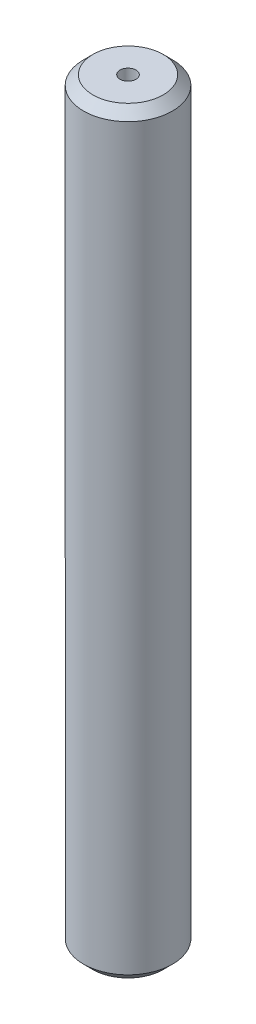
ISO-10303-21;
HEADER;
FILE_DESCRIPTION(('STEP AP214'),'2;1');
FILE_NAME('part.step','',(''),(''),'','','');
FILE_SCHEMA(('AUTOMOTIVE_DESIGN { 1 0 10303 214 1 1 1 1 }'));
ENDSEC;
DATA;
#1=APPLICATION_CONTEXT('core data for automotive mechanical design processes');
#2=APPLICATION_PROTOCOL_DEFINITION('international standard','automotive_design',2000,#1);
#3=PRODUCT_CONTEXT('',#1,'mechanical');
#4=PRODUCT('Part','Part','',(#3));
#5=PRODUCT_RELATED_PRODUCT_CATEGORY('part','',(#4));
#6=PRODUCT_DEFINITION_FORMATION('','',#4);
#7=PRODUCT_DEFINITION_CONTEXT('part definition',#1,'design');
#8=PRODUCT_DEFINITION('design','',#6,#7);
#9=PRODUCT_DEFINITION_SHAPE('','',#8);
#10=(LENGTH_UNIT() NAMED_UNIT(*) SI_UNIT(.MILLI.,.METRE.));
#11=(NAMED_UNIT(*) PLANE_ANGLE_UNIT() SI_UNIT($,.RADIAN.));
#12=(NAMED_UNIT(*) SI_UNIT($,.STERADIAN.) SOLID_ANGLE_UNIT());
#13=UNCERTAINTY_MEASURE_WITH_UNIT(LENGTH_MEASURE(1.E-05),#10,'distance_accuracy_value','');
#14=(GEOMETRIC_REPRESENTATION_CONTEXT(3) GLOBAL_UNCERTAINTY_ASSIGNED_CONTEXT((#13)) GLOBAL_UNIT_ASSIGNED_CONTEXT((#10,
#11,#12)) REPRESENTATION_CONTEXT('',''));
#15=CARTESIAN_POINT('',(0.,0.,0.));
#16=DIRECTION('',(0.,0.,1.));
#17=DIRECTION('',(1.,0.,0.));
#18=AXIS2_PLACEMENT_3D('',#15,#16,#17);
#19=CARTESIAN_POINT('',(0.,85.2303831328711,0.));
#20=DIRECTION('',(0.,-1.,0.));
#21=DIRECTION('',(0.,0.,-1.));
#22=AXIS2_PLACEMENT_3D('',#19,#20,#21);
#23=CYLINDRICAL_SURFACE('',#22,5.);
#24=CARTESIAN_POINT('',(0.,84.1824366444883,0.));
#25=DIRECTION('',(0.,1.,0.));
#26=DIRECTION('',(0.,0.,1.));
#27=AXIS2_PLACEMENT_3D('',#24,#25,#26);
#28=CIRCLE('',#27,5.);
#29=CARTESIAN_POINT('',(0.,84.1824366444883,-5.00000000000001));
#30=VERTEX_POINT('',#29);
#31=EDGE_CURVE('E50',#30,#30,#28,.F.);
#32=ORIENTED_EDGE('',*,*,#31,.T.);
#33=EDGE_LOOP('',(#32));
#34=FACE_BOUND('',#33,.T.);
#35=CARTESIAN_POINT('',(0.,1.04794648838263,0.));
#36=DIRECTION('',(0.,1.,0.));
#37=DIRECTION('',(0.,0.,1.));
#38=AXIS2_PLACEMENT_3D('',#35,#36,#37);
#39=CIRCLE('',#38,5.);
#40=CARTESIAN_POINT('',(0.,1.04794648838263,5.));
#41=VERTEX_POINT('',#40);
#42=EDGE_CURVE('E51',#41,#41,#39,.T.);
#43=ORIENTED_EDGE('',*,*,#42,.T.);
#44=EDGE_LOOP('',(#43));
#45=FACE_BOUND('',#44,.T.);
#46=ADVANCED_FACE('F39',(#34,#45),#23,.T.);
#47=CARTESIAN_POINT('',(0.,85.2303831328711,0.));
#48=DIRECTION('',(0.,1.,0.));
#49=DIRECTION('',(0.,0.,1.));
#50=AXIS2_PLACEMENT_3D('',#47,#48,#49);
#51=PLANE('',#50);
#52=CARTESIAN_POINT('',(0.,85.2303831328711,0.));
#53=DIRECTION('',(0.,1.,0.));
#54=DIRECTION('',(0.,0.,1.));
#55=AXIS2_PLACEMENT_3D('',#52,#53,#54);
#56=CIRCLE('',#55,3.95205351161732);
#57=CARTESIAN_POINT('',(0.,85.230383132871,-3.95205351161733));
#58=VERTEX_POINT('',#57);
#59=EDGE_CURVE('E54',#58,#58,#56,.T.);
#60=ORIENTED_EDGE('',*,*,#59,.T.);
#61=EDGE_LOOP('',(#60));
#62=FACE_BOUND('',#61,.T.);
#63=CARTESIAN_POINT('',(0.,85.2303831328711,0.));
#64=DIRECTION('',(0.,1.,0.));
#65=DIRECTION('',(0.,0.,1.));
#66=AXIS2_PLACEMENT_3D('',#63,#64,#65);
#67=CIRCLE('',#66,0.90016622351087);
#68=CARTESIAN_POINT('',(0.,85.2303831328711,0.90016622351087));
#69=VERTEX_POINT('',#68);
#70=EDGE_CURVE('E58',#69,#69,#67,.T.);
#71=ORIENTED_EDGE('',*,*,#70,.F.);
#72=EDGE_LOOP('',(#71));
#73=FACE_BOUND('',#72,.T.);
#74=ADVANCED_FACE('F69',(#62,#73),#51,.T.);
#75=CARTESIAN_POINT('',(0.,0.,0.));
#76=DIRECTION('',(0.,1.,0.));
#77=DIRECTION('',(0.,0.,1.));
#78=AXIS2_PLACEMENT_3D('',#75,#76,#77);
#79=PLANE('',#78);
#80=CARTESIAN_POINT('',(0.,0.,0.));
#81=DIRECTION('',(0.,1.,0.));
#82=DIRECTION('',(0.,0.,1.));
#83=AXIS2_PLACEMENT_3D('',#80,#81,#82);
#84=CIRCLE('',#83,3.95205351161735);
#85=CARTESIAN_POINT('',(0.,0.,3.95205351161735));
#86=VERTEX_POINT('',#85);
#87=EDGE_CURVE('E10',#86,#86,#84,.F.);
#88=ORIENTED_EDGE('',*,*,#87,.T.);
#89=EDGE_LOOP('',(#88));
#90=FACE_BOUND('',#89,.T.);
#91=CARTESIAN_POINT('',(0.,0.,0.));
#92=DIRECTION('',(0.,1.,0.));
#93=DIRECTION('',(0.,0.,1.));
#94=AXIS2_PLACEMENT_3D('',#91,#92,#93);
#95=CIRCLE('',#94,0.90016622351087);
#96=CARTESIAN_POINT('',(0.,0.,0.90016622351087));
#97=VERTEX_POINT('',#96);
#98=EDGE_CURVE('E63',#97,#97,#95,.T.);
#99=ORIENTED_EDGE('',*,*,#98,.T.);
#100=EDGE_LOOP('',(#99));
#101=FACE_BOUND('',#100,.T.);
#102=ADVANCED_FACE('F75',(#90,#101),#79,.F.);
#103=CARTESIAN_POINT('',(0.,85.2303831328711,0.));
#104=DIRECTION('',(0.,-1.,0.));
#105=DIRECTION('',(0.,0.,-1.));
#106=AXIS2_PLACEMENT_3D('',#103,#104,#105);
#107=CYLINDRICAL_SURFACE('',#106,0.90016622351087);
#108=ORIENTED_EDGE('',*,*,#70,.T.);
#109=EDGE_LOOP('',(#108));
#110=FACE_BOUND('',#109,.T.);
#111=ORIENTED_EDGE('',*,*,#98,.F.);
#112=EDGE_LOOP('',(#111));
#113=FACE_BOUND('',#112,.T.);
#114=ADVANCED_FACE('F70',(#110,#113),#107,.F.);
#115=CARTESIAN_POINT('',(0.,85.2303831328711,0.));
#116=DIRECTION('',(0.,-1.,0.));
#117=DIRECTION('',(0.,0.,-1.));
#118=AXIS2_PLACEMENT_3D('',#115,#116,#117);
#119=CONICAL_SURFACE('',#118,3.95205351161732,0.785398163397436);
#120=CARTESIAN_POINT('',(0.,84.1824366444883,-5.00000000000001));
#121=CARTESIAN_POINT('',(0.,84.1933527537423,-4.98908389074602));
#122=CARTESIAN_POINT('',(0.,84.2042688629963,-4.97816778149204));
#123=CARTESIAN_POINT('',(0.,84.2261010815043,-4.95633556298406));
#124=CARTESIAN_POINT('',(0.,84.2370171907583,-4.94541945373008));
#125=CARTESIAN_POINT('',(0.,84.2588494092662,-4.9235872352221));
#126=CARTESIAN_POINT('',(0.,84.2697655185202,-4.91267112596812));
#127=CARTESIAN_POINT('',(0.,84.2915977370282,-4.89083890746014));
#128=CARTESIAN_POINT('',(0.,84.3025138462822,-4.87992279820616));
#129=CARTESIAN_POINT('',(0.,84.3243460647902,-4.85809057969819));
#130=CARTESIAN_POINT('',(0.,84.3352621740442,-4.8471744704442));
#131=CARTESIAN_POINT('',(0.,84.3570943925521,-4.82534225193623));
#132=CARTESIAN_POINT('',(0.,84.3680105018061,-4.81442614268224));
#133=CARTESIAN_POINT('',(0.,84.3898427203141,-4.79259392417427));
#134=CARTESIAN_POINT('',(0.,84.4007588295681,-4.78167781492028));
#135=CARTESIAN_POINT('',(0.,84.422591048076,-4.75984559641231));
#136=CARTESIAN_POINT('',(0.,84.43350715733,-4.74892948715832));
#137=CARTESIAN_POINT('',(0.,84.455339375838,-4.72709726865035));
#138=CARTESIAN_POINT('',(0.,84.466255485092,-4.71618115939637));
#139=CARTESIAN_POINT('',(0.,84.4880877036,-4.69434894088839));
#140=CARTESIAN_POINT('',(0.,84.499003812854,-4.68343283163441));
#141=CARTESIAN_POINT('',(0.,84.5208360313619,-4.66160061312643));
#142=CARTESIAN_POINT('',(0.,84.5317521406159,-4.65068450387245));
#143=CARTESIAN_POINT('',(0.,84.5535843591239,-4.62885228536448));
#144=CARTESIAN_POINT('',(0.,84.5645004683779,-4.61793617611049));
#145=CARTESIAN_POINT('',(0.,84.5863326868858,-4.59610395760252));
#146=CARTESIAN_POINT('',(0.,84.5972487961398,-4.58518784834853));
#147=CARTESIAN_POINT('',(0.,84.6190810146478,-4.56335562984056));
#148=CARTESIAN_POINT('',(0.,84.6299971239018,-4.55243952058657));
#149=CARTESIAN_POINT('',(0.,84.6518293424098,-4.5306073020786));
#150=CARTESIAN_POINT('',(0.,84.6627454516637,-4.51969119282461));
#151=CARTESIAN_POINT('',(0.,84.6845776701717,-4.49785897431664));
#152=CARTESIAN_POINT('',(0.,84.6954937794257,-4.48694286506266));
#153=CARTESIAN_POINT('',(0.,84.7173259979337,-4.46511064655468));
#154=CARTESIAN_POINT('',(0.,84.7282421071877,-4.45419453730069));
#155=CARTESIAN_POINT('',(0.,84.7500743256956,-4.43236231879272));
#156=CARTESIAN_POINT('',(0.,84.7609904349496,-4.42144620953874));
#157=CARTESIAN_POINT('',(0.,84.7828226534576,-4.39961399103077));
#158=CARTESIAN_POINT('',(0.,84.7937387627116,-4.38869788177678));
#159=CARTESIAN_POINT('',(0.,84.8155709812196,-4.36686566326881));
#160=CARTESIAN_POINT('',(0.,84.8264870904735,-4.35594955401482));
#161=CARTESIAN_POINT('',(0.,84.8483193089815,-4.33411733550685));
#162=CARTESIAN_POINT('',(0.,84.8592354182355,-4.32320122625286));
#163=CARTESIAN_POINT('',(0.,84.8810676367435,-4.30136900774489));
#164=CARTESIAN_POINT('',(0.,84.8919837459975,-4.2904528984909));
#165=CARTESIAN_POINT('',(0.,84.9138159645054,-4.26862067998293));
#166=CARTESIAN_POINT('',(0.,84.9247320737594,-4.25770457072894));
#167=CARTESIAN_POINT('',(0.,84.9465642922674,-4.23587235222097));
#168=CARTESIAN_POINT('',(0.,84.9574804015214,-4.22495624296698));
#169=CARTESIAN_POINT('',(0.,84.9793126200294,-4.20312402445901));
#170=CARTESIAN_POINT('',(0.,84.9902287292833,-4.19220791520503));
#171=CARTESIAN_POINT('',(0.,85.0120609477913,-4.17037569669705));
#172=CARTESIAN_POINT('',(0.,85.0229770570453,-4.15945958744307));
#173=CARTESIAN_POINT('',(0.,85.0448092755533,-4.1376273689351));
#174=CARTESIAN_POINT('',(0.,85.0557253848073,-4.12671125968111));
#175=CARTESIAN_POINT('',(0.,85.0775576033152,-4.10487904117314));
#176=CARTESIAN_POINT('',(0.,85.0884737125692,-4.09396293191915));
#177=CARTESIAN_POINT('',(0.,85.1103059310772,-4.07213071341118));
#178=CARTESIAN_POINT('',(0.,85.1212220403312,-4.06121460415719));
#179=CARTESIAN_POINT('',(0.,85.1430542588392,-4.03938238564922));
#180=CARTESIAN_POINT('',(0.,85.1539703680932,-4.02846627639523));
#181=CARTESIAN_POINT('',(0.,85.1758025866011,-4.00663405788726));
#182=CARTESIAN_POINT('',(0.,85.1867186958551,-3.99571794863327));
#183=CARTESIAN_POINT('',(0.,85.2085509143631,-3.9738857301253));
#184=CARTESIAN_POINT('',(0.,85.2194670236171,-3.96296962087131));
#185=CARTESIAN_POINT('',(0.,85.2303831328711,-3.95205351161733));
#186=B_SPLINE_CURVE_WITH_KNOTS('',3,(#120,#121,#122,#123,#124,#125,#126,#127,#128,#129,#130,
#131,#132,#133,#134,#135,#136,#137,#138,#139,#140,#141,#142,#143,#144,#145,#146,#147,#148,#149,
#150,#151,#152,#153,#154,#155,#156,#157,#158,#159,#160,#161,#162,#163,#164,#165,#166,#167,#168,
#169,#170,#171,#172,#173,#174,#175,#176,#177,#178,#179,#180,#181,#182,#183,#184,#185),
.UNSPECIFIED.,.F.,.F.,(4,2,2,2,2,2,2,2,2,2,2,2,2,2,2,2,2,2,2,2,2,2,2,2,2,2,2,2,2,2,2,2,4),(0.,
0.0463131292660092,0.0926262585320086,0.138939387798007,0.185252517064017,0.231565646330015,
0.277878775596015,0.324191904862014,0.370505034128023,0.416818163394022,0.463131292660021,
0.50944442192603,0.555757551192029,0.602070680458029,0.648383809724027,0.694696938990037,
0.741010068256035,0.787323197522035,0.833636326788043,0.879949456054043,0.926262585320042,
0.972575714586041,1.01888884385205,1.06520197311805,1.11151510238405,1.15782823165006,
1.20414136091606,1.25045449018206,1.29676761944806,1.34308074871406,1.38939387798006,
1.43570700724606,1.48202013651207),.UNSPECIFIED.);
#187=EDGE_CURVE('BSEAM81',#30,#58,#186,.T.);
#188=ORIENTED_EDGE('',*,*,#31,.F.);
#189=ORIENTED_EDGE('',*,*,#59,.F.);
#190=ORIENTED_EDGE('',*,*,#187,.T.);
#191=ORIENTED_EDGE('',*,*,#187,.F.);
#192=EDGE_LOOP('',(#188,#190,#189,#191));
#193=FACE_BOUND('',#192,.T.);
#194=ADVANCED_FACE('F81',(#193),#119,.T.);
#195=CARTESIAN_POINT('',(0.,1.04794648838263,0.));
#196=DIRECTION('',(0.,1.,0.));
#197=DIRECTION('',(0.,0.,1.));
#198=AXIS2_PLACEMENT_3D('',#195,#196,#197);
#199=CONICAL_SURFACE('',#198,5.,0.785398163397456);
#200=ORIENTED_EDGE('',*,*,#87,.F.);
#201=EDGE_LOOP('',(#200));
#202=FACE_BOUND('',#201,.T.);
#203=ORIENTED_EDGE('',*,*,#42,.F.);
#204=EDGE_LOOP('',(#203));
#205=FACE_BOUND('',#204,.T.);
#206=ADVANCED_FACE('F45',(#202,#205),#199,.T.);
#207=CLOSED_SHELL('',(#46,#74,#102,#114,#194,#206));
#208=MANIFOLD_SOLID_BREP('B2',#207);
#209=ADVANCED_BREP_SHAPE_REPRESENTATION('',(#18,#208),#14);
#210=SHAPE_DEFINITION_REPRESENTATION(#9,#209);
ENDSEC;
END-ISO-10303-21;
